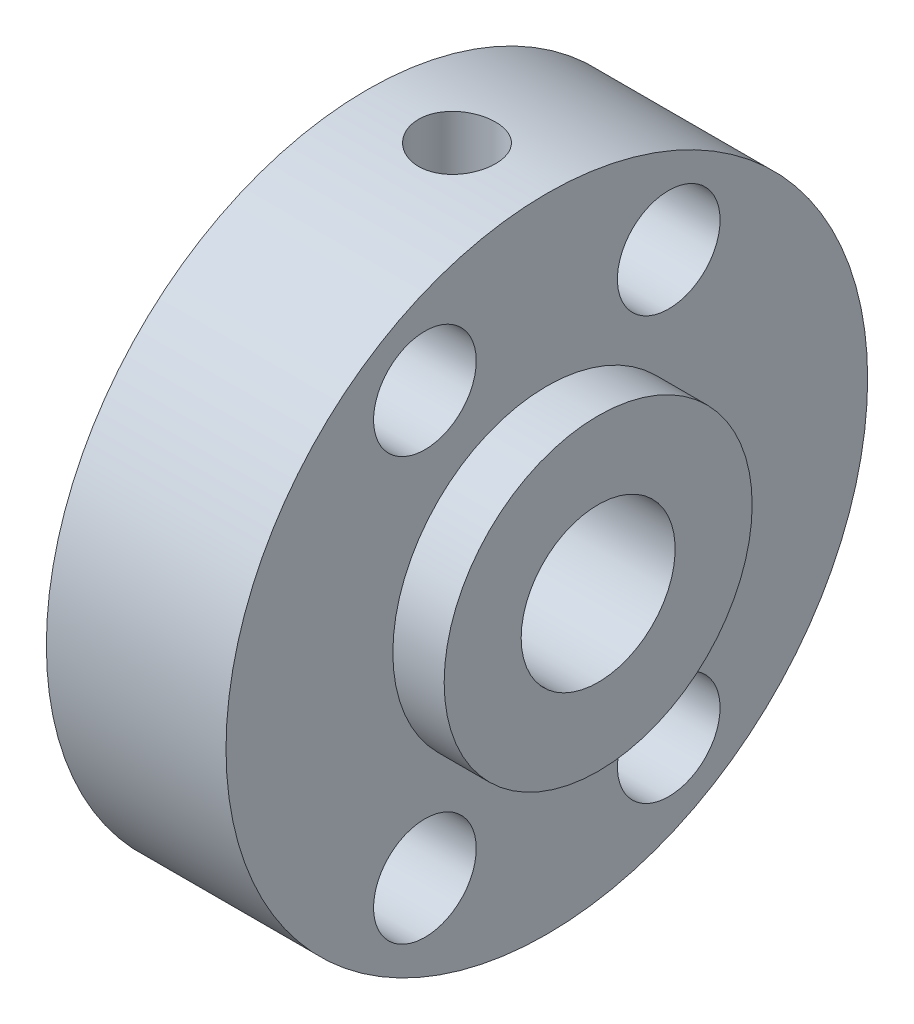
ISO-10303-21;
HEADER;
FILE_DESCRIPTION(('STEP AP214'),'2;1');
FILE_NAME('part.step','',(''),(''),'','','');
FILE_SCHEMA(('AUTOMOTIVE_DESIGN { 1 0 10303 214 1 1 1 1 }'));
ENDSEC;
DATA;
#1=APPLICATION_CONTEXT('core data for automotive mechanical design processes');
#2=APPLICATION_PROTOCOL_DEFINITION('international standard','automotive_design',2000,#1);
#3=PRODUCT_CONTEXT('',#1,'mechanical');
#4=PRODUCT('Part','Part','',(#3));
#5=PRODUCT_RELATED_PRODUCT_CATEGORY('part','',(#4));
#6=PRODUCT_DEFINITION_FORMATION('','',#4);
#7=PRODUCT_DEFINITION_CONTEXT('part definition',#1,'design');
#8=PRODUCT_DEFINITION('design','',#6,#7);
#9=PRODUCT_DEFINITION_SHAPE('','',#8);
#10=(LENGTH_UNIT() NAMED_UNIT(*) SI_UNIT(.MILLI.,.METRE.));
#11=(NAMED_UNIT(*) PLANE_ANGLE_UNIT() SI_UNIT($,.RADIAN.));
#12=(NAMED_UNIT(*) SI_UNIT($,.STERADIAN.) SOLID_ANGLE_UNIT());
#13=UNCERTAINTY_MEASURE_WITH_UNIT(LENGTH_MEASURE(1.E-05),#10,'distance_accuracy_value','');
#14=(GEOMETRIC_REPRESENTATION_CONTEXT(3) GLOBAL_UNCERTAINTY_ASSIGNED_CONTEXT((#13)) GLOBAL_UNIT_ASSIGNED_CONTEXT((#10,
#11,#12)) REPRESENTATION_CONTEXT('',''));
#15=CARTESIAN_POINT('',(0.,0.,0.));
#16=DIRECTION('',(0.,0.,1.));
#17=DIRECTION('',(1.,0.,0.));
#18=AXIS2_PLACEMENT_3D('',#15,#16,#17);
#19=CARTESIAN_POINT('',(0.,0.,0.));
#20=DIRECTION('',(-1.,0.,0.));
#21=DIRECTION('',(0.,0.,1.));
#22=AXIS2_PLACEMENT_3D('',#19,#20,#21);
#23=CYLINDRICAL_SURFACE('',#22,3.);
#24=CARTESIAN_POINT('',(9.,0.,0.));
#25=DIRECTION('',(-1.,0.,0.));
#26=DIRECTION('',(0.,0.,1.));
#27=AXIS2_PLACEMENT_3D('',#24,#25,#26);
#28=CIRCLE('',#27,3.);
#29=CARTESIAN_POINT('',(9.,0.,3.00000000000001));
#30=VERTEX_POINT('',#29);
#31=EDGE_CURVE('E58',#30,#30,#28,.T.);
#32=ORIENTED_EDGE('',*,*,#31,.F.);
#33=EDGE_LOOP('',(#32));
#34=FACE_BOUND('',#33,.T.);
#35=CARTESIAN_POINT('',(0.,0.,0.));
#36=DIRECTION('',(-1.,0.,0.));
#37=DIRECTION('',(0.,0.,1.));
#38=AXIS2_PLACEMENT_3D('',#35,#36,#37);
#39=CIRCLE('',#38,3.);
#40=CARTESIAN_POINT('',(0.,0.,3.00000000000001));
#41=VERTEX_POINT('',#40);
#42=EDGE_CURVE('E10',#41,#41,#39,.T.);
#43=ORIENTED_EDGE('',*,*,#42,.T.);
#44=EDGE_LOOP('',(#43));
#45=FACE_BOUND('',#44,.T.);
#46=CARTESIAN_POINT('',(3.5,2.59807621135332,-1.50000000000001));
#47=CARTESIAN_POINT('',(3.57816171229288,2.59808302092691,-1.49999454461179));
#48=CARTESIAN_POINT('',(3.65642211728758,2.60165701781633,-1.49384995609985));
#49=CARTESIAN_POINT('',(3.81054089701573,2.61543549678077,-1.46958481484712));
#50=CARTESIAN_POINT('',(3.88639387256511,2.62565391083343,-1.45143909683129));
#51=CARTESIAN_POINT('',(4.03317749651591,2.65124019908102,-1.40414992304973));
#52=CARTESIAN_POINT('',(4.1041319787104,2.66658065209878,-1.37506492874062));
#53=CARTESIAN_POINT('',(4.24013630299509,2.70063997225284,-1.30690128806458));
#54=CARTESIAN_POINT('',(4.30518582539369,2.71935902214097,-1.26782210105366));
#55=CARTESIAN_POINT('',(4.43345859283626,2.75995303586163,-1.17699981079631));
#56=CARTESIAN_POINT('',(4.49608870351034,2.78196095456929,-1.12447805421566));
#57=CARTESIAN_POINT('',(4.61211258261009,2.82557974178559,-1.00988071142171));
#58=CARTESIAN_POINT('',(4.66550174387528,2.84719040746879,-0.947800388673443));
#59=CARTESIAN_POINT('',(4.76505072672149,2.88932215429428,-0.810734345121817));
#60=CARTESIAN_POINT('',(4.81048065178931,2.90967159627258,-0.735160783518865));
#61=CARTESIAN_POINT('',(4.88771127986865,2.94526134149294,-0.576235539899267));
#62=CARTESIAN_POINT('',(4.91952058420574,2.96050486775618,-0.492888807207248));
#63=CARTESIAN_POINT('',(4.96625699195163,2.98320691866362,-0.327067415888982));
#64=CARTESIAN_POINT('',(4.9822242895333,2.99114220331339,-0.244952685733239));
#65=CARTESIAN_POINT('',(5.00024917801256,3.00011375769099,-0.0788559430467778));
#66=CARTESIAN_POINT('',(5.00231518519357,3.00115420176885,0.00512490876560507));
#67=CARTESIAN_POINT('',(4.99287998904447,2.99644472874676,0.164748786635622));
#68=CARTESIAN_POINT('',(4.98254297671816,2.99127743838241,0.240481798765182));
#69=CARTESIAN_POINT('',(4.95067873414301,2.97561367889621,0.388970657877477));
#70=CARTESIAN_POINT('',(4.92915066653566,2.96511681099592,0.461726281640885));
#71=CARTESIAN_POINT('',(4.87537615086528,2.93957374931482,0.603464087354319));
#72=CARTESIAN_POINT('',(4.84298553024189,2.92446662293798,0.672380135272747));
#73=CARTESIAN_POINT('',(4.76860487569775,2.89106468980032,0.803965202269976));
#74=CARTESIAN_POINT('',(4.72661140504647,2.87276874236232,0.866631973257964));
#75=CARTESIAN_POINT('',(4.62965697270047,2.8326659159885,0.990260491347286));
#76=CARTESIAN_POINT('',(4.57384545751097,2.81069063997265,1.05050111254402));
#77=CARTESIAN_POINT('',(4.45311541260473,2.76681510880217,1.16115655544665));
#78=CARTESIAN_POINT('',(4.38818994158891,2.74491492398444,1.21156381736134));
#79=CARTESIAN_POINT('',(4.24602771136387,2.70216234138729,1.30425800196331));
#80=CARTESIAN_POINT('',(4.16827096541867,2.68146479986063,1.34582597246705));
#81=CARTESIAN_POINT('',(4.00559349296149,2.64563175417865,1.41497866950182));
#82=CARTESIAN_POINT('',(3.92068035047365,2.63049045069102,1.44257798731633));
#83=CARTESIAN_POINT('',(3.75317823307582,2.60916953725552,1.48077031653755));
#84=CARTESIAN_POINT('',(3.67093832143467,2.60237483772746,1.49253768317993));
#85=CARTESIAN_POINT('',(3.50539798772518,2.59676879042417,1.50227541991711));
#86=CARTESIAN_POINT('',(3.42209835632032,2.59795180333971,1.50025553597253));
#87=CARTESIAN_POINT('',(3.26651912213191,2.6075150481088,1.48355406501594));
#88=CARTESIAN_POINT('',(3.19403082333811,2.61509381259982,1.47028172506867));
#89=CARTESIAN_POINT('',(3.05244832059357,2.63541032327014,1.43354442694863));
#90=CARTESIAN_POINT('',(2.98335522388009,2.64814974007555,1.41007616793542));
#91=CARTESIAN_POINT('',(2.84688300364596,2.6780433311949,1.35247138290733));
#92=CARTESIAN_POINT('',(2.77973147471969,2.69537464864597,1.31789109553906));
#93=CARTESIAN_POINT('',(2.65179609269152,2.73234179245874,1.23943059602368));
#94=CARTESIAN_POINT('',(2.59101553473008,2.75197880032721,1.19554560649832));
#95=CARTESIAN_POINT('',(2.46953184871468,2.79431997684504,1.09325575079828));
#96=CARTESIAN_POINT('',(2.40980427392353,2.81709874731434,1.03371790847243));
#97=CARTESIAN_POINT('',(2.30088164300962,2.86101352466839,0.905106743097417));
#98=CARTESIAN_POINT('',(2.25169014465417,2.88214897511564,0.836030211983022));
#99=CARTESIAN_POINT('',(2.16413941107483,2.92112042536435,0.68780304383814));
#100=CARTESIAN_POINT('',(2.12610032268364,2.93885462508044,0.608434646361158));
#101=CARTESIAN_POINT('',(2.06429314421392,2.96825032438952,0.443283546961605));
#102=CARTESIAN_POINT('',(2.04051252295051,2.97991715514561,0.357506552088254));
#103=CARTESIAN_POINT('',(2.00994715373797,2.99501262272824,0.190469523495621));
#104=CARTESIAN_POINT('',(2.00180318618582,2.99909891862286,0.109517165775679));
#105=CARTESIAN_POINT('',(1.99873510181841,3.00063195562698,-0.0526889789268118));
#106=CARTESIAN_POINT('',(2.00380635721466,2.99808102100339,-0.133942650442635));
#107=CARTESIAN_POINT('',(2.02612461019343,2.98700953256887,-0.288806988475724));
#108=CARTESIAN_POINT('',(2.0425472738865,2.97889342001985,-0.362568476716899));
#109=CARTESIAN_POINT('',(2.08599049895445,2.95788140495135,-0.506168928275431));
#110=CARTESIAN_POINT('',(2.11301258014018,2.94498481699197,-0.57600732743327));
#111=CARTESIAN_POINT('',(2.17809057824896,2.91488896122184,-0.713135109367337));
#112=CARTESIAN_POINT('',(2.21656898481174,2.89752925798199,-0.780187714050082));
#113=CARTESIAN_POINT('',(2.30293689628856,2.86032199712738,-0.907161962721042));
#114=CARTESIAN_POINT('',(2.35083072367351,2.84047329837541,-0.967080311122357));
#115=CARTESIAN_POINT('',(2.46019570853405,2.79792915339941,-1.08437100623534));
#116=CARTESIAN_POINT('',(2.52254373121577,2.77514698517546,-1.14089652680893));
#117=CARTESIAN_POINT('',(2.65617608169464,2.73094614244278,-1.24299493109203));
#118=CARTESIAN_POINT('',(2.72746823130153,2.70952868642799,-1.28855812501509));
#119=CARTESIAN_POINT('',(2.87995496987144,2.66999407957375,-1.36864661967849));
#120=CARTESIAN_POINT('',(2.96139129669309,2.65200261384403,-1.40277759894144));
#121=CARTESIAN_POINT('',(3.12999860650965,2.62299234492526,-1.45631806425964));
#122=CARTESIAN_POINT('',(3.21714933336903,2.61195024221555,-1.475776786763));
#123=CARTESIAN_POINT('',(3.33770803347799,2.60293908902685,-1.49155051179663));
#124=CARTESIAN_POINT('',(3.37005184159682,2.60112193507726,-1.49471415744581));
#125=CARTESIAN_POINT('',(3.43492472102336,2.59868903831623,-1.49894010763498));
#126=CARTESIAN_POINT('',(3.46745380457881,2.59807337587664,-1.50000227159982));
#127=CARTESIAN_POINT('',(3.5,2.59807621135332,-1.50000000000001));
#128=B_SPLINE_CURVE_WITH_KNOTS('',3,(#46,#47,#48,#49,#50,#51,#52,#53,#54,#55,#56,#57,#58,#59,
#60,#61,#62,#63,#64,#65,#66,#67,#68,#69,#70,#71,#72,#73,#74,#75,#76,#77,#78,#79,#80,#81,#82,#83,
#84,#85,#86,#87,#88,#89,#90,#91,#92,#93,#94,#95,#96,#97,#98,#99,#100,#101,#102,#103,#104,#105,
#106,#107,#108,#109,#110,#111,#112,#113,#114,#115,#116,#117,#118,#119,#120,#121,#122,#123,#124,
#125,#126,#127),.UNSPECIFIED.,.T.,.F.,(4,2,2,2,2,2,2,2,2,2,2,2,2,2,2,2,2,2,2,2,2,2,2,2,2,2,2,2,
2,2,2,2,2,2,2,2,2,2,2,2,4),(0.,0.234348183892077,0.469189339237216,0.702792893878338,
0.936409088167734,1.18929346874737,1.44230356626559,1.71236838358147,1.98226240445837,
2.23295227451904,2.48349035529062,2.71224146226809,2.94100968776184,3.17294302096721,
3.40495949025408,3.65890787185336,3.91305072368879,4.18333262594173,4.45333161317558,
4.70193436281318,4.95036139782559,5.17161275136038,5.39293578654094,5.6245094460913,
5.85620229330069,6.11710115370918,6.37808797467302,6.64596272119448,6.91360169713157,
7.15668405584229,7.39968130190956,7.62666637307237,7.85368400268018,8.09041126079207,
8.32724745151078,8.587653627751,8.84828914267731,9.11716123557907,9.3851269950414,
9.48270202777964,9.58028358741811),.UNSPECIFIED.);
#129=CARTESIAN_POINT('',(3.5,2.59807621135332,-1.50000000000001));
#130=VERTEX_POINT('',#129);
#131=EDGE_CURVE('E83',#130,#130,#128,.T.);
#132=ORIENTED_EDGE('',*,*,#131,.F.);
#133=EDGE_LOOP('',(#132));
#134=FACE_BOUND('',#133,.T.);
#135=ADVANCED_FACE('F30',(#34,#45,#134),#23,.F.);
#136=CARTESIAN_POINT('',(0.,0.,0.));
#137=DIRECTION('',(-1.,0.,0.));
#138=DIRECTION('',(0.,0.,1.));
#139=AXIS2_PLACEMENT_3D('',#136,#137,#138);
#140=CYLINDRICAL_SURFACE('',#139,12.5);
#141=CARTESIAN_POINT('',(0.,0.,0.));
#142=DIRECTION('',(-1.,0.,0.));
#143=DIRECTION('',(0.,0.,1.));
#144=AXIS2_PLACEMENT_3D('',#141,#142,#143);
#145=CIRCLE('',#144,12.5);
#146=CARTESIAN_POINT('',(0.,0.,12.5000000000001));
#147=VERTEX_POINT('',#146);
#148=EDGE_CURVE('E43',#147,#147,#145,.T.);
#149=ORIENTED_EDGE('',*,*,#148,.F.);
#150=EDGE_LOOP('',(#149));
#151=FACE_BOUND('',#150,.T.);
#152=CARTESIAN_POINT('',(7.,0.,0.));
#153=DIRECTION('',(-1.,0.,0.));
#154=DIRECTION('',(0.,0.,1.));
#155=AXIS2_PLACEMENT_3D('',#152,#153,#154);
#156=CIRCLE('',#155,12.5);
#157=CARTESIAN_POINT('',(7.,0.,12.5000000000001));
#158=VERTEX_POINT('',#157);
#159=EDGE_CURVE('E47',#158,#158,#156,.T.);
#160=ORIENTED_EDGE('',*,*,#159,.T.);
#161=EDGE_LOOP('',(#160));
#162=FACE_BOUND('',#161,.T.);
#163=CARTESIAN_POINT('',(3.5,12.4096736459909,-1.49999999999999));
#164=CARTESIAN_POINT('',(3.41607042940482,12.4096748089168,-1.49999641586387));
#165=CARTESIAN_POINT('',(3.3320877399393,12.4105342894214,-1.4929320674817));
#166=CARTESIAN_POINT('',(3.16645769398422,12.4138782255216,-1.4648615935482));
#167=CARTESIAN_POINT('',(3.08481290215949,12.4163643992984,-1.44384072619508));
#168=CARTESIAN_POINT('',(2.92628079724309,12.422676155262,-1.38848417307917));
#169=CARTESIAN_POINT('',(2.84939036943188,12.426500849368,-1.35415731394875));
#170=CARTESIAN_POINT('',(2.70247642894951,12.4350576249844,-1.27318168778972));
#171=CARTESIAN_POINT('',(2.63245170421602,12.4397895458966,-1.22653510106007));
#172=CARTESIAN_POINT('',(2.50088011419491,12.4496550027324,-1.12198571965019));
#173=CARTESIAN_POINT('',(2.43937385282569,12.4547902908254,-1.06403198625323));
#174=CARTESIAN_POINT('',(2.32693564091904,12.4648680792729,-0.938622932174395));
#175=CARTESIAN_POINT('',(2.2760042070291,12.4698105701985,-0.871167147527062));
#176=CARTESIAN_POINT('',(2.18601673353186,12.4789637011531,-0.728414784233975));
#177=CARTESIAN_POINT('',(2.14699729213017,12.4831720690333,-0.653094976924481));
#178=CARTESIAN_POINT('',(2.08217576980762,12.4903635621621,-0.496912883636368));
#179=CARTESIAN_POINT('',(2.05637323512613,12.4933467294734,-0.416050788042745));
#180=CARTESIAN_POINT('',(2.01883887194828,12.4977393662263,-0.251493928492507));
#181=CARTESIAN_POINT('',(2.00703967327711,12.4991563682204,-0.167814735521651));
#182=CARTESIAN_POINT('',(1.99763820034474,12.5002827183051,0.000347248334330437));
#183=CARTESIAN_POINT('',(2.00003540892088,12.4999921286018,0.0848300098342234));
#184=CARTESIAN_POINT('',(2.01890456092569,12.4977421462634,0.251742833758816));
#185=CARTESIAN_POINT('',(2.03530405248621,12.4957913442169,0.33418121878415));
#186=CARTESIAN_POINT('',(2.08159907585801,12.490449821119,0.495127185045633));
#187=CARTESIAN_POINT('',(2.11149484709082,12.4870590745234,0.573634696521356));
#188=CARTESIAN_POINT('',(2.18401136445326,12.4792038952278,0.724715561629731));
#189=CARTESIAN_POINT('',(2.22666361800324,12.4747368094346,0.797273648637713));
#190=CARTESIAN_POINT('',(2.3234594494781,12.465229048358,0.934229460099416));
#191=CARTESIAN_POINT('',(2.37760351320781,12.4601883488299,0.998626839383493));
#192=CARTESIAN_POINT('',(2.49625217477023,12.4500603372649,1.11785860561528));
#193=CARTESIAN_POINT('',(2.56081989068677,12.4449729316271,1.1726301943919));
#194=CARTESIAN_POINT('',(2.69826575683978,12.4353563023037,1.27056795912578));
#195=CARTESIAN_POINT('',(2.77114392958225,12.4308270801298,1.31373410365266));
#196=CARTESIAN_POINT('',(2.92319624507368,12.4228396027608,1.38723839179328));
#197=CARTESIAN_POINT('',(3.00237272062896,12.4193817467283,1.4175717557882));
#198=CARTESIAN_POINT('',(3.16474617975059,12.4139364153306,1.46449505016187));
#199=CARTESIAN_POINT('',(3.24794298505964,12.4119488748367,1.48108558929276));
#200=CARTESIAN_POINT('',(3.41544154818833,12.4096810007819,1.49996964356083));
#201=CARTESIAN_POINT('',(3.49973321794055,12.4093901280317,1.50235142135385));
#202=CARTESIAN_POINT('',(3.66751439042146,12.4105206650573,1.492982990278));
#203=CARTESIAN_POINT('',(3.75100390884369,12.4119420412651,1.48123305845624));
#204=CARTESIAN_POINT('',(3.91454789179899,12.416327313749,1.44400895971008));
#205=CARTESIAN_POINT('',(3.99461217340465,12.4192864301079,1.41857731249467));
#206=CARTESIAN_POINT('',(4.14933964148798,12.4264098926624,1.35475538396312));
#207=CARTESIAN_POINT('',(4.22400265225153,12.4305742780458,1.31636468129309));
#208=CARTESIAN_POINT('',(4.36620814748731,12.439664365665,1.22749651360809));
#209=CARTESIAN_POINT('',(4.43371414344064,12.4445936804928,1.17696103570739));
#210=CARTESIAN_POINT('',(4.55931755650588,12.4546467770184,1.06532008918352));
#211=CARTESIAN_POINT('',(4.61741463670292,12.459770565672,1.00421424221809));
#212=CARTESIAN_POINT('',(4.72285987361744,12.4696675472456,0.87278213633385));
#213=CARTESIAN_POINT('',(4.7701501232557,12.4744387628015,0.802409249708908));
#214=CARTESIAN_POINT('',(4.85223910466454,12.483063621558,0.654668214705295));
#215=CARTESIAN_POINT('',(4.88703807118722,12.486917282002,0.577300197822225));
#216=CARTESIAN_POINT('',(4.9430605024379,12.4932640215258,0.41795962236002));
#217=CARTESIAN_POINT('',(4.96431775994212,12.4957604851314,0.335999085323616));
#218=CARTESIAN_POINT('',(4.99276337179107,12.4991255682254,0.169640292495767));
#219=CARTESIAN_POINT('',(4.99995230834657,12.4999942550784,0.0852421377306613));
#220=CARTESIAN_POINT('',(5.00004692205616,12.5000056524324,-0.0830300031277979));
#221=CARTESIAN_POINT('',(4.99304201834162,12.4991591682624,-0.166903952329406));
#222=CARTESIAN_POINT('',(4.96513677254877,12.4958567701035,-0.332273612398092));
#223=CARTESIAN_POINT('',(4.94423643502524,12.4934008566422,-0.41376932404472));
#224=CARTESIAN_POINT('',(4.8891609924342,12.4871544009745,-0.572059777991793));
#225=CARTESIAN_POINT('',(4.85498981777276,12.4833642539575,-0.64885590437399));
#226=CARTESIAN_POINT('',(4.7743519652078,12.4748696221581,-0.795637705262665));
#227=CARTESIAN_POINT('',(4.72788518779857,12.4701651299762,-0.865623324646872));
#228=CARTESIAN_POINT('',(4.62364315899687,12.4603319681132,-0.997254742124315));
#229=CARTESIAN_POINT('',(4.56580132233711,12.4552009088046,-1.05884763393841));
#230=CARTESIAN_POINT('',(4.44058848142378,12.4451123432295,-1.17148865356206));
#231=CARTESIAN_POINT('',(4.37321521774934,12.4401548784623,-1.22253427406545));
#232=CARTESIAN_POINT('',(4.23057853191475,12.4309559603765,-1.31278537364375));
#233=CARTESIAN_POINT('',(4.15528783586352,12.4267171228204,-1.35194799100157));
#234=CARTESIAN_POINT('',(3.99919112312461,12.419466118837,-1.41701902911872));
#235=CARTESIAN_POINT('',(3.91839126440112,12.4164526081982,-1.44294198213014));
#236=CARTESIAN_POINT('',(3.78097023044731,12.4127313618495,-1.47453505036821));
#237=CARTESIAN_POINT('',(3.72521862402006,12.4115903654975,-1.48407082470975));
#238=CARTESIAN_POINT('',(3.61298603393288,12.4100611186528,-1.49680448454757));
#239=CARTESIAN_POINT('',(3.5565050552187,12.4096728630584,-1.50000241299708));
#240=CARTESIAN_POINT('',(3.5,12.4096736459909,-1.49999999999999));
#241=B_SPLINE_CURVE_WITH_KNOTS('',3,(#163,#164,#165,#166,#167,#168,#169,#170,#171,#172,#173,
#174,#175,#176,#177,#178,#179,#180,#181,#182,#183,#184,#185,#186,#187,#188,#189,#190,#191,#192,
#193,#194,#195,#196,#197,#198,#199,#200,#201,#202,#203,#204,#205,#206,#207,#208,#209,#210,#211,
#212,#213,#214,#215,#216,#217,#218,#219,#220,#221,#222,#223,#224,#225,#226,#227,#228,#229,#230,
#231,#232,#233,#234,#235,#236,#237,#238,#239,#240),.UNSPECIFIED.,.T.,.F.,(4,2,2,2,2,2,2,2,2,2,2,
2,2,2,2,2,2,2,2,2,2,2,2,2,2,2,2,2,2,2,2,2,2,2,2,2,2,2,4),(0.,0.251582306609611,
0.503430774819315,0.755112462522265,1.00674963836111,1.25954776660378,1.51235824273612,
1.76593780876772,2.01950866836451,2.27185458608056,2.52419131111317,2.77523023079349,
3.0262736040334,3.2779422267764,3.52962149067922,3.78288622204425,4.03615163930561,
4.28951130338295,4.54285974404081,4.79463277043148,5.04640086098251,5.29739099483105,
5.54838929022026,5.80061125155308,6.05284224246469,6.30639464647639,6.55994228515917,
6.81285470170485,7.06575665136925,7.31707030939073,7.56838388503436,7.81962308616498,
8.07086432058378,8.32362252061908,8.57644073759114,8.83016031080824,9.08360079205964,
9.25297814464873,9.42235434931909),.UNSPECIFIED.);
#242=CARTESIAN_POINT('',(3.5,12.4096736459909,-1.49999999999999));
#243=VERTEX_POINT('',#242);
#244=EDGE_CURVE('E34',#243,#243,#241,.T.);
#245=ORIENTED_EDGE('',*,*,#244,.F.);
#246=EDGE_LOOP('',(#245));
#247=FACE_BOUND('',#246,.T.);
#248=ADVANCED_FACE('F124',(#151,#162,#247),#140,.T.);
#249=CARTESIAN_POINT('',(0.,3.00000000000003,0.));
#250=DIRECTION('',(1.,0.,0.));
#251=DIRECTION('',(0.,0.,-1.));
#252=AXIS2_PLACEMENT_3D('',#249,#250,#251);
#253=PLANE('',#252);
#254=CARTESIAN_POINT('',(0.,8.22724133595217,-4.75000000000001));
#255=DIRECTION('',(1.,0.,0.));
#256=DIRECTION('',(0.,0.,-1.));
#257=AXIS2_PLACEMENT_3D('',#254,#255,#256);
#258=CIRCLE('',#257,2.);
#259=CARTESIAN_POINT('',(0.,8.22724133595217,-6.75000000000002));
#260=VERTEX_POINT('',#259);
#261=EDGE_CURVE('E65',#260,#260,#258,.T.);
#262=ORIENTED_EDGE('',*,*,#261,.T.);
#263=EDGE_LOOP('',(#262));
#264=FACE_BOUND('',#263,.T.);
#265=CARTESIAN_POINT('',(0.,-8.22724133595217,4.75000000000002));
#266=DIRECTION('',(1.,0.,0.));
#267=DIRECTION('',(0.,0.,-1.));
#268=AXIS2_PLACEMENT_3D('',#265,#266,#267);
#269=CIRCLE('',#268,2.);
#270=CARTESIAN_POINT('',(0.,-8.22724133595218,2.75000000000002));
#271=VERTEX_POINT('',#270);
#272=EDGE_CURVE('E71',#271,#271,#269,.T.);
#273=ORIENTED_EDGE('',*,*,#272,.T.);
#274=EDGE_LOOP('',(#273));
#275=FACE_BOUND('',#274,.T.);
#276=CARTESIAN_POINT('',(0.,-8.22724133595215,-4.75000000000002));
#277=DIRECTION('',(1.,0.,0.));
#278=DIRECTION('',(0.,0.,-1.));
#279=AXIS2_PLACEMENT_3D('',#276,#277,#278);
#280=CIRCLE('',#279,2.);
#281=CARTESIAN_POINT('',(0.,-8.22724133595215,-6.75000000000003));
#282=VERTEX_POINT('',#281);
#283=EDGE_CURVE('E72',#282,#282,#280,.T.);
#284=ORIENTED_EDGE('',*,*,#283,.T.);
#285=EDGE_LOOP('',(#284));
#286=FACE_BOUND('',#285,.T.);
#287=CARTESIAN_POINT('',(0.,8.22724133595223,4.75000000000002));
#288=DIRECTION('',(1.,0.,0.));
#289=DIRECTION('',(0.,0.,-1.));
#290=AXIS2_PLACEMENT_3D('',#287,#288,#289);
#291=CIRCLE('',#290,2.);
#292=CARTESIAN_POINT('',(0.,8.22724133595223,2.75000000000002));
#293=VERTEX_POINT('',#292);
#294=EDGE_CURVE('E61',#293,#293,#291,.T.);
#295=ORIENTED_EDGE('',*,*,#294,.T.);
#296=EDGE_LOOP('',(#295));
#297=FACE_BOUND('',#296,.T.);
#298=ORIENTED_EDGE('',*,*,#42,.F.);
#299=EDGE_LOOP('',(#298));
#300=FACE_BOUND('',#299,.T.);
#301=ORIENTED_EDGE('',*,*,#148,.T.);
#302=EDGE_LOOP('',(#301));
#303=FACE_BOUND('',#302,.T.);
#304=ADVANCED_FACE('F122',(#264,#275,#286,#297,#300,#303),#253,.F.);
#305=CARTESIAN_POINT('',(7.,12.5000000000001,0.));
#306=DIRECTION('',(-1.,0.,0.));
#307=DIRECTION('',(0.,0.,1.));
#308=AXIS2_PLACEMENT_3D('',#305,#306,#307);
#309=PLANE('',#308);
#310=CARTESIAN_POINT('',(7.,8.22724133595217,-4.75000000000001));
#311=DIRECTION('',(1.,0.,0.));
#312=DIRECTION('',(0.,0.,-1.));
#313=AXIS2_PLACEMENT_3D('',#310,#311,#312);
#314=CIRCLE('',#313,2.);
#315=CARTESIAN_POINT('',(7.,8.22724133595217,-6.75000000000002));
#316=VERTEX_POINT('',#315);
#317=EDGE_CURVE('E75',#316,#316,#314,.T.);
#318=ORIENTED_EDGE('',*,*,#317,.F.);
#319=EDGE_LOOP('',(#318));
#320=FACE_BOUND('',#319,.T.);
#321=CARTESIAN_POINT('',(7.,-8.22724133595217,4.75000000000002));
#322=DIRECTION('',(1.,0.,0.));
#323=DIRECTION('',(0.,0.,-1.));
#324=AXIS2_PLACEMENT_3D('',#321,#322,#323);
#325=CIRCLE('',#324,2.);
#326=CARTESIAN_POINT('',(7.,-8.22724133595218,2.75000000000002));
#327=VERTEX_POINT('',#326);
#328=EDGE_CURVE('E68',#327,#327,#325,.T.);
#329=ORIENTED_EDGE('',*,*,#328,.F.);
#330=EDGE_LOOP('',(#329));
#331=FACE_BOUND('',#330,.T.);
#332=CARTESIAN_POINT('',(7.,-8.22724133595216,-4.75000000000002));
#333=DIRECTION('',(1.,0.,0.));
#334=DIRECTION('',(0.,0.,-1.));
#335=AXIS2_PLACEMENT_3D('',#332,#333,#334);
#336=CIRCLE('',#335,2.);
#337=CARTESIAN_POINT('',(7.,-8.22724133595216,-6.75000000000003));
#338=VERTEX_POINT('',#337);
#339=EDGE_CURVE('E80',#338,#338,#336,.T.);
#340=ORIENTED_EDGE('',*,*,#339,.F.);
#341=EDGE_LOOP('',(#340));
#342=FACE_BOUND('',#341,.T.);
#343=CARTESIAN_POINT('',(7.,8.22724133595223,4.75000000000004));
#344=DIRECTION('',(1.,0.,0.));
#345=DIRECTION('',(0.,0.,-1.));
#346=AXIS2_PLACEMENT_3D('',#343,#344,#345);
#347=CIRCLE('',#346,2.);
#348=CARTESIAN_POINT('',(7.,8.22724133595222,2.75000000000003));
#349=VERTEX_POINT('',#348);
#350=EDGE_CURVE('E62',#349,#349,#347,.T.);
#351=ORIENTED_EDGE('',*,*,#350,.F.);
#352=EDGE_LOOP('',(#351));
#353=FACE_BOUND('',#352,.T.);
#354=ORIENTED_EDGE('',*,*,#159,.F.);
#355=EDGE_LOOP('',(#354));
#356=FACE_BOUND('',#355,.T.);
#357=CARTESIAN_POINT('',(7.,0.,0.));
#358=DIRECTION('',(-1.,0.,0.));
#359=DIRECTION('',(0.,0.,1.));
#360=AXIS2_PLACEMENT_3D('',#357,#358,#359);
#361=CIRCLE('',#360,6.);
#362=CARTESIAN_POINT('',(7.,0.,6.00000000000003));
#363=VERTEX_POINT('',#362);
#364=EDGE_CURVE('E52',#363,#363,#361,.T.);
#365=ORIENTED_EDGE('',*,*,#364,.T.);
#366=EDGE_LOOP('',(#365));
#367=FACE_BOUND('',#366,.T.);
#368=ADVANCED_FACE('F119',(#320,#331,#342,#353,#356,#367),#309,.F.);
#369=CARTESIAN_POINT('',(0.,0.,0.));
#370=DIRECTION('',(-1.,0.,0.));
#371=DIRECTION('',(0.,0.,1.));
#372=AXIS2_PLACEMENT_3D('',#369,#370,#371);
#373=CYLINDRICAL_SURFACE('',#372,6.);
#374=ORIENTED_EDGE('',*,*,#364,.F.);
#375=EDGE_LOOP('',(#374));
#376=FACE_BOUND('',#375,.T.);
#377=CARTESIAN_POINT('',(9.,0.,0.));
#378=DIRECTION('',(-1.,0.,0.));
#379=DIRECTION('',(0.,0.,1.));
#380=AXIS2_PLACEMENT_3D('',#377,#378,#379);
#381=CIRCLE('',#380,6.);
#382=CARTESIAN_POINT('',(9.,0.,6.00000000000002));
#383=VERTEX_POINT('',#382);
#384=EDGE_CURVE('E55',#383,#383,#381,.T.);
#385=ORIENTED_EDGE('',*,*,#384,.T.);
#386=EDGE_LOOP('',(#385));
#387=FACE_BOUND('',#386,.T.);
#388=ADVANCED_FACE('F115',(#376,#387),#373,.T.);
#389=CARTESIAN_POINT('',(9.,6.00000000000005,0.));
#390=DIRECTION('',(-1.,0.,0.));
#391=DIRECTION('',(0.,0.,1.));
#392=AXIS2_PLACEMENT_3D('',#389,#390,#391);
#393=PLANE('',#392);
#394=ORIENTED_EDGE('',*,*,#384,.F.);
#395=EDGE_LOOP('',(#394));
#396=FACE_BOUND('',#395,.T.);
#397=ORIENTED_EDGE('',*,*,#31,.T.);
#398=EDGE_LOOP('',(#397));
#399=FACE_BOUND('',#398,.T.);
#400=ADVANCED_FACE('F111',(#396,#399),#393,.F.);
#401=CARTESIAN_POINT('',(0.,8.22724133595223,4.75000000000002));
#402=DIRECTION('',(1.,0.,0.));
#403=DIRECTION('',(0.,0.,-1.));
#404=AXIS2_PLACEMENT_3D('',#401,#402,#403);
#405=CYLINDRICAL_SURFACE('',#404,2.);
#406=ORIENTED_EDGE('',*,*,#294,.F.);
#407=EDGE_LOOP('',(#406));
#408=FACE_BOUND('',#407,.T.);
#409=ORIENTED_EDGE('',*,*,#350,.T.);
#410=EDGE_LOOP('',(#409));
#411=FACE_BOUND('',#410,.T.);
#412=ADVANCED_FACE('F101',(#408,#411),#405,.F.);
#413=CARTESIAN_POINT('',(0.,-8.22724133595215,-4.75000000000002));
#414=DIRECTION('',(1.,0.,0.));
#415=DIRECTION('',(0.,0.,-1.));
#416=AXIS2_PLACEMENT_3D('',#413,#414,#415);
#417=CYLINDRICAL_SURFACE('',#416,2.);
#418=ORIENTED_EDGE('',*,*,#283,.F.);
#419=EDGE_LOOP('',(#418));
#420=FACE_BOUND('',#419,.T.);
#421=ORIENTED_EDGE('',*,*,#339,.T.);
#422=EDGE_LOOP('',(#421));
#423=FACE_BOUND('',#422,.T.);
#424=ADVANCED_FACE('F96',(#420,#423),#417,.F.);
#425=CARTESIAN_POINT('',(0.,-8.22724133595217,4.75000000000002));
#426=DIRECTION('',(1.,0.,0.));
#427=DIRECTION('',(0.,0.,-1.));
#428=AXIS2_PLACEMENT_3D('',#425,#426,#427);
#429=CYLINDRICAL_SURFACE('',#428,2.);
#430=ORIENTED_EDGE('',*,*,#272,.F.);
#431=EDGE_LOOP('',(#430));
#432=FACE_BOUND('',#431,.T.);
#433=ORIENTED_EDGE('',*,*,#328,.T.);
#434=EDGE_LOOP('',(#433));
#435=FACE_BOUND('',#434,.T.);
#436=ADVANCED_FACE('F100',(#432,#435),#429,.F.);
#437=CARTESIAN_POINT('',(0.,8.22724133595217,-4.75000000000001));
#438=DIRECTION('',(1.,0.,0.));
#439=DIRECTION('',(0.,0.,-1.));
#440=AXIS2_PLACEMENT_3D('',#437,#438,#439);
#441=CYLINDRICAL_SURFACE('',#440,2.);
#442=ORIENTED_EDGE('',*,*,#261,.F.);
#443=EDGE_LOOP('',(#442));
#444=FACE_BOUND('',#443,.T.);
#445=ORIENTED_EDGE('',*,*,#317,.T.);
#446=EDGE_LOOP('',(#445));
#447=FACE_BOUND('',#446,.T.);
#448=ADVANCED_FACE('F94',(#444,#447),#441,.F.);
#449=CARTESIAN_POINT('',(3.5,30.0000000000001,0.));
#450=DIRECTION('',(0.,-1.,0.));
#451=DIRECTION('',(0.,0.,-1.));
#452=AXIS2_PLACEMENT_3D('',#449,#450,#451);
#453=CYLINDRICAL_SURFACE('',#452,1.5);
#454=ORIENTED_EDGE('',*,*,#244,.T.);
#455=EDGE_LOOP('',(#454));
#456=FACE_BOUND('',#455,.T.);
#457=ORIENTED_EDGE('',*,*,#131,.T.);
#458=EDGE_LOOP('',(#457));
#459=FACE_BOUND('',#458,.T.);
#460=ADVANCED_FACE('F90',(#456,#459),#453,.F.);
#461=CLOSED_SHELL('',(#135,#248,#304,#368,#388,#400,#412,#424,#436,#448,#460));
#462=MANIFOLD_SOLID_BREP('B2',#461);
#463=ADVANCED_BREP_SHAPE_REPRESENTATION('',(#18,#462),#14);
#464=SHAPE_DEFINITION_REPRESENTATION(#9,#463);
ENDSEC;
END-ISO-10303-21;
